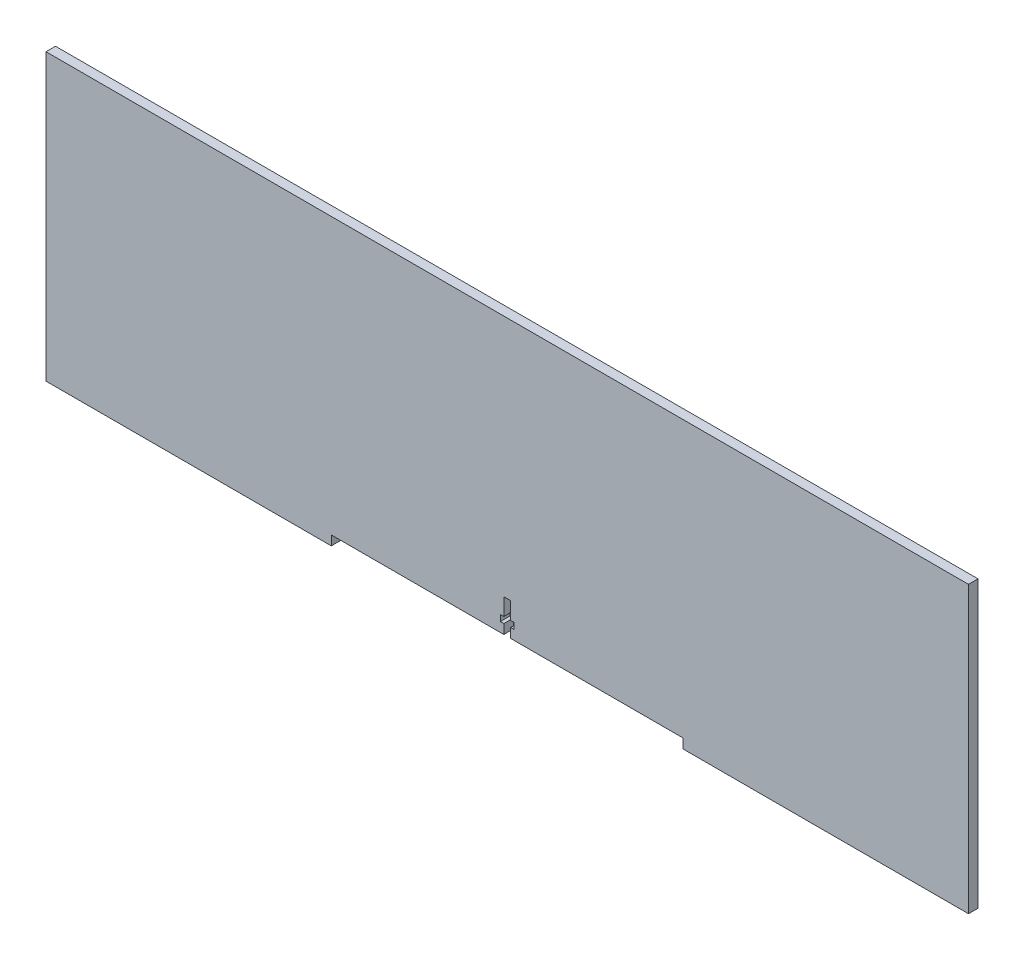
ISO-10303-21;
HEADER;
FILE_DESCRIPTION(('STEP AP214'),'2;1');
FILE_NAME('part.step','',(''),(''),'','','');
FILE_SCHEMA(('AUTOMOTIVE_DESIGN { 1 0 10303 214 1 1 1 1 }'));
ENDSEC;
DATA;
#1=APPLICATION_CONTEXT('core data for automotive mechanical design processes');
#2=APPLICATION_PROTOCOL_DEFINITION('international standard','automotive_design',2000,#1);
#3=PRODUCT_CONTEXT('',#1,'mechanical');
#4=PRODUCT('Part','Part','',(#3));
#5=PRODUCT_RELATED_PRODUCT_CATEGORY('part','',(#4));
#6=PRODUCT_DEFINITION_FORMATION('','',#4);
#7=PRODUCT_DEFINITION_CONTEXT('part definition',#1,'design');
#8=PRODUCT_DEFINITION('design','',#6,#7);
#9=PRODUCT_DEFINITION_SHAPE('','',#8);
#10=(LENGTH_UNIT() NAMED_UNIT(*) SI_UNIT(.MILLI.,.METRE.));
#11=(NAMED_UNIT(*) PLANE_ANGLE_UNIT() SI_UNIT($,.RADIAN.));
#12=(NAMED_UNIT(*) SI_UNIT($,.STERADIAN.) SOLID_ANGLE_UNIT());
#13=UNCERTAINTY_MEASURE_WITH_UNIT(LENGTH_MEASURE(1.E-05),#10,'distance_accuracy_value','');
#14=(GEOMETRIC_REPRESENTATION_CONTEXT(3) GLOBAL_UNCERTAINTY_ASSIGNED_CONTEXT((#13)) GLOBAL_UNIT_ASSIGNED_CONTEXT((#10,
#11,#12)) REPRESENTATION_CONTEXT('',''));
#15=CARTESIAN_POINT('',(0.,0.,0.));
#16=DIRECTION('',(0.,0.,1.));
#17=DIRECTION('',(1.,0.,0.));
#18=AXIS2_PLACEMENT_3D('',#15,#16,#17);
#19=CARTESIAN_POINT('',(0.,0.,5.));
#20=DIRECTION('',(0.,0.,1.));
#21=DIRECTION('',(1.,0.,0.));
#22=AXIS2_PLACEMENT_3D('',#19,#20,#21);
#23=PLANE('',#22);
#24=DIRECTION('',(1.,0.,0.));
#25=VECTOR('',#24,1.);
#26=CARTESIAN_POINT('',(0.,-5.,5.));
#27=LINE('',#26,#25);
#28=CARTESIAN_POINT('',(670.,-5.,5.));
#29=VERTEX_POINT('',#28);
#30=CARTESIAN_POINT('',(820.,-5.,5.));
#31=VERTEX_POINT('',#30);
#32=EDGE_CURVE('E182',#29,#31,#27,.T.);
#33=ORIENTED_EDGE('',*,*,#32,.T.);
#34=DIRECTION('',(0.,1.,0.));
#35=VECTOR('',#34,1.);
#36=CARTESIAN_POINT('',(820.,0.,5.));
#37=LINE('',#36,#35);
#38=CARTESIAN_POINT('',(820.,145.,5.));
#39=VERTEX_POINT('',#38);
#40=EDGE_CURVE('E170',#31,#39,#37,.T.);
#41=ORIENTED_EDGE('',*,*,#40,.T.);
#42=DIRECTION('',(1.,0.,0.));
#43=VECTOR('',#42,1.);
#44=CARTESIAN_POINT('',(0.,145.,5.));
#45=LINE('',#44,#43);
#46=CARTESIAN_POINT('',(335.,145.,5.));
#47=VERTEX_POINT('',#46);
#48=EDGE_CURVE('E180',#47,#39,#45,.T.);
#49=ORIENTED_EDGE('',*,*,#48,.F.);
#50=DIRECTION('',(0.,-1.,0.));
#51=VECTOR('',#50,1.);
#52=CARTESIAN_POINT('',(335.,0.,5.));
#53=LINE('',#52,#51);
#54=CARTESIAN_POINT('',(335.,-5.,5.));
#55=VERTEX_POINT('',#54);
#56=EDGE_CURVE('E270',#47,#55,#53,.T.);
#57=ORIENTED_EDGE('',*,*,#56,.T.);
#58=DIRECTION('',(-1.,0.,0.));
#59=VECTOR('',#58,1.);
#60=CARTESIAN_POINT('',(0.,-5.,5.));
#61=LINE('',#60,#59);
#62=CARTESIAN_POINT('',(485.,-5.,5.));
#63=VERTEX_POINT('',#62);
#64=EDGE_CURVE('E187',#63,#55,#61,.T.);
#65=ORIENTED_EDGE('',*,*,#64,.F.);
#66=DIRECTION('',(0.,-1.,0.));
#67=VECTOR('',#66,1.);
#68=CARTESIAN_POINT('',(485.,0.,5.));
#69=LINE('',#68,#67);
#70=CARTESIAN_POINT('',(485.,0.,5.));
#71=VERTEX_POINT('',#70);
#72=EDGE_CURVE('E190',#71,#63,#69,.T.);
#73=ORIENTED_EDGE('',*,*,#72,.F.);
#74=DIRECTION('',(1.,0.,0.));
#75=VECTOR('',#74,1.);
#76=CARTESIAN_POINT('',(0.,0.,5.));
#77=LINE('',#76,#75);
#78=CARTESIAN_POINT('',(575.7,0.,5.));
#79=VERTEX_POINT('',#78);
#80=EDGE_CURVE('E199',#71,#79,#77,.T.);
#81=ORIENTED_EDGE('',*,*,#80,.T.);
#82=DIRECTION('',(0.,1.,0.));
#83=VECTOR('',#82,1.);
#84=CARTESIAN_POINT('',(575.7,0.,5.));
#85=LINE('',#84,#83);
#86=CARTESIAN_POINT('',(575.7,5.00000000000001,5.));
#87=VERTEX_POINT('',#86);
#88=EDGE_CURVE('E299',#79,#87,#85,.T.);
#89=ORIENTED_EDGE('',*,*,#88,.T.);
#90=DIRECTION('',(-1.,0.,0.));
#91=VECTOR('',#90,1.);
#92=CARTESIAN_POINT('',(575.7,5.00000000000001,5.));
#93=LINE('',#92,#91);
#94=CARTESIAN_POINT('',(573.9,5.00000000000001,5.));
#95=VERTEX_POINT('',#94);
#96=EDGE_CURVE('E302',#87,#95,#93,.T.);
#97=ORIENTED_EDGE('',*,*,#96,.T.);
#98=DIRECTION('',(0.,1.,0.));
#99=VECTOR('',#98,1.);
#100=CARTESIAN_POINT('',(573.9,5.00000000000001,5.));
#101=LINE('',#100,#99);
#102=CARTESIAN_POINT('',(573.9,8.20000000000001,5.));
#103=VERTEX_POINT('',#102);
#104=EDGE_CURVE('E305',#95,#103,#101,.T.);
#105=ORIENTED_EDGE('',*,*,#104,.T.);
#106=DIRECTION('',(1.,0.,0.));
#107=VECTOR('',#106,1.);
#108=CARTESIAN_POINT('',(573.9,8.20000000000001,5.));
#109=LINE('',#108,#107);
#110=CARTESIAN_POINT('',(575.7,8.20000000000001,5.));
#111=VERTEX_POINT('',#110);
#112=EDGE_CURVE('E308',#103,#111,#109,.T.);
#113=ORIENTED_EDGE('',*,*,#112,.T.);
#114=DIRECTION('',(0.,1.,0.));
#115=VECTOR('',#114,1.);
#116=CARTESIAN_POINT('',(575.7,8.20000000000001,5.));
#117=LINE('',#116,#115);
#118=CARTESIAN_POINT('',(575.7,17.2,5.));
#119=VERTEX_POINT('',#118);
#120=EDGE_CURVE('E278',#111,#119,#117,.T.);
#121=ORIENTED_EDGE('',*,*,#120,.T.);
#122=DIRECTION('',(1.,0.,0.));
#123=VECTOR('',#122,1.);
#124=CARTESIAN_POINT('',(575.7,17.2,5.));
#125=LINE('',#124,#123);
#126=CARTESIAN_POINT('',(579.3,17.2,5.));
#127=VERTEX_POINT('',#126);
#128=EDGE_CURVE('E281',#119,#127,#125,.T.);
#129=ORIENTED_EDGE('',*,*,#128,.T.);
#130=DIRECTION('',(0.,1.,0.));
#131=VECTOR('',#130,1.);
#132=CARTESIAN_POINT('',(579.3,8.20000000000001,5.));
#133=LINE('',#132,#131);
#134=CARTESIAN_POINT('',(579.3,8.20000000000001,5.));
#135=VERTEX_POINT('',#134);
#136=EDGE_CURVE('E284',#135,#127,#133,.T.);
#137=ORIENTED_EDGE('',*,*,#136,.F.);
#138=DIRECTION('',(-1.,0.,0.));
#139=VECTOR('',#138,1.);
#140=CARTESIAN_POINT('',(581.1,8.20000000000001,5.));
#141=LINE('',#140,#139);
#142=CARTESIAN_POINT('',(581.1,8.20000000000001,5.));
#143=VERTEX_POINT('',#142);
#144=EDGE_CURVE('E287',#143,#135,#141,.T.);
#145=ORIENTED_EDGE('',*,*,#144,.F.);
#146=DIRECTION('',(0.,1.,0.));
#147=VECTOR('',#146,1.);
#148=CARTESIAN_POINT('',(581.1,5.00000000000001,5.));
#149=LINE('',#148,#147);
#150=CARTESIAN_POINT('',(581.1,5.00000000000001,5.));
#151=VERTEX_POINT('',#150);
#152=EDGE_CURVE('E290',#151,#143,#149,.T.);
#153=ORIENTED_EDGE('',*,*,#152,.F.);
#154=DIRECTION('',(1.,0.,0.));
#155=VECTOR('',#154,1.);
#156=CARTESIAN_POINT('',(579.3,5.00000000000001,5.));
#157=LINE('',#156,#155);
#158=CARTESIAN_POINT('',(579.3,5.00000000000001,5.));
#159=VERTEX_POINT('',#158);
#160=EDGE_CURVE('E293',#159,#151,#157,.T.);
#161=ORIENTED_EDGE('',*,*,#160,.F.);
#162=DIRECTION('',(0.,1.,0.));
#163=VECTOR('',#162,1.);
#164=CARTESIAN_POINT('',(579.3,0.,5.));
#165=LINE('',#164,#163);
#166=CARTESIAN_POINT('',(579.3,0.,5.));
#167=VERTEX_POINT('',#166);
#168=EDGE_CURVE('E296',#167,#159,#165,.T.);
#169=ORIENTED_EDGE('',*,*,#168,.F.);
#170=CARTESIAN_POINT('',(670.,0.,5.));
#171=VERTEX_POINT('',#170);
#172=EDGE_CURVE('E198',#167,#171,#77,.T.);
#173=ORIENTED_EDGE('',*,*,#172,.T.);
#174=DIRECTION('',(0.,-1.,0.));
#175=VECTOR('',#174,1.);
#176=CARTESIAN_POINT('',(670.,0.,5.));
#177=LINE('',#176,#175);
#178=EDGE_CURVE('E202',#171,#29,#177,.T.);
#179=ORIENTED_EDGE('',*,*,#178,.T.);
#180=EDGE_LOOP('',(#33,#41,#49,#57,#65,#73,#81,#89,#97,#105,#113,#121,#129,#137,#145,#153,#161,
#169,#173,#179));
#181=FACE_BOUND('',#180,.T.);
#182=ADVANCED_FACE('F35',(#181),#23,.T.);
#183=CARTESIAN_POINT('',(0.,0.,0.));
#184=DIRECTION('',(0.,0.,1.));
#185=DIRECTION('',(1.,0.,0.));
#186=AXIS2_PLACEMENT_3D('',#183,#184,#185);
#187=PLANE('',#186);
#188=DIRECTION('',(0.,1.,0.));
#189=VECTOR('',#188,1.);
#190=CARTESIAN_POINT('',(820.,0.,0.));
#191=LINE('',#190,#189);
#192=CARTESIAN_POINT('',(820.,-5.,0.));
#193=VERTEX_POINT('',#192);
#194=CARTESIAN_POINT('',(820.,145.,0.));
#195=VERTEX_POINT('',#194);
#196=EDGE_CURVE('E50',#193,#195,#191,.T.);
#197=ORIENTED_EDGE('',*,*,#196,.F.);
#198=DIRECTION('',(1.,0.,0.));
#199=VECTOR('',#198,1.);
#200=CARTESIAN_POINT('',(0.,-5.,0.));
#201=LINE('',#200,#199);
#202=CARTESIAN_POINT('',(670.,-5.,0.));
#203=VERTEX_POINT('',#202);
#204=EDGE_CURVE('E205',#203,#193,#201,.T.);
#205=ORIENTED_EDGE('',*,*,#204,.F.);
#206=DIRECTION('',(0.,-1.,0.));
#207=VECTOR('',#206,1.);
#208=CARTESIAN_POINT('',(670.,0.,0.));
#209=LINE('',#208,#207);
#210=CARTESIAN_POINT('',(670.,0.,0.));
#211=VERTEX_POINT('',#210);
#212=EDGE_CURVE('E192',#211,#203,#209,.T.);
#213=ORIENTED_EDGE('',*,*,#212,.F.);
#214=DIRECTION('',(1.,0.,0.));
#215=VECTOR('',#214,1.);
#216=CARTESIAN_POINT('',(0.,0.,0.));
#217=LINE('',#216,#215);
#218=CARTESIAN_POINT('',(579.3,0.,0.));
#219=VERTEX_POINT('',#218);
#220=EDGE_CURVE('E217',#219,#211,#217,.T.);
#221=ORIENTED_EDGE('',*,*,#220,.F.);
#222=DIRECTION('',(0.,1.,0.));
#223=VECTOR('',#222,1.);
#224=CARTESIAN_POINT('',(579.3,0.,0.));
#225=LINE('',#224,#223);
#226=CARTESIAN_POINT('',(579.3,5.00000000000001,0.));
#227=VERTEX_POINT('',#226);
#228=EDGE_CURVE('E209',#219,#227,#225,.T.);
#229=ORIENTED_EDGE('',*,*,#228,.T.);
#230=DIRECTION('',(1.,0.,0.));
#231=VECTOR('',#230,1.);
#232=CARTESIAN_POINT('',(0.,4.99999999999973,0.));
#233=LINE('',#232,#231);
#234=CARTESIAN_POINT('',(581.1,5.00000000000001,0.));
#235=VERTEX_POINT('',#234);
#236=EDGE_CURVE('E255',#227,#235,#233,.T.);
#237=ORIENTED_EDGE('',*,*,#236,.T.);
#238=DIRECTION('',(0.,1.,0.));
#239=VECTOR('',#238,1.);
#240=CARTESIAN_POINT('',(581.1,0.,0.));
#241=LINE('',#240,#239);
#242=CARTESIAN_POINT('',(581.1,8.20000000000001,0.));
#243=VERTEX_POINT('',#242);
#244=EDGE_CURVE('E252',#235,#243,#241,.T.);
#245=ORIENTED_EDGE('',*,*,#244,.T.);
#246=DIRECTION('',(-1.,0.,0.));
#247=VECTOR('',#246,1.);
#248=CARTESIAN_POINT('',(0.,8.20000000000001,0.));
#249=LINE('',#248,#247);
#250=CARTESIAN_POINT('',(579.3,8.20000000000001,0.));
#251=VERTEX_POINT('',#250);
#252=EDGE_CURVE('E249',#243,#251,#249,.T.);
#253=ORIENTED_EDGE('',*,*,#252,.T.);
#254=DIRECTION('',(0.,1.,0.));
#255=VECTOR('',#254,1.);
#256=CARTESIAN_POINT('',(579.3,0.,0.));
#257=LINE('',#256,#255);
#258=CARTESIAN_POINT('',(579.3,17.2,0.));
#259=VERTEX_POINT('',#258);
#260=EDGE_CURVE('E246',#251,#259,#257,.T.);
#261=ORIENTED_EDGE('',*,*,#260,.T.);
#262=DIRECTION('',(1.,0.,0.));
#263=VECTOR('',#262,1.);
#264=CARTESIAN_POINT('',(0.,17.2,0.));
#265=LINE('',#264,#263);
#266=CARTESIAN_POINT('',(575.7,17.2,0.));
#267=VERTEX_POINT('',#266);
#268=EDGE_CURVE('E244',#267,#259,#265,.T.);
#269=ORIENTED_EDGE('',*,*,#268,.F.);
#270=DIRECTION('',(0.,1.,0.));
#271=VECTOR('',#270,1.);
#272=CARTESIAN_POINT('',(575.7,0.,0.));
#273=LINE('',#272,#271);
#274=CARTESIAN_POINT('',(575.7,8.20000000000001,0.));
#275=VERTEX_POINT('',#274);
#276=EDGE_CURVE('E242',#275,#267,#273,.T.);
#277=ORIENTED_EDGE('',*,*,#276,.F.);
#278=DIRECTION('',(1.,0.,0.));
#279=VECTOR('',#278,1.);
#280=CARTESIAN_POINT('',(0.,8.20000000000001,0.));
#281=LINE('',#280,#279);
#282=CARTESIAN_POINT('',(573.9,8.20000000000001,0.));
#283=VERTEX_POINT('',#282);
#284=EDGE_CURVE('E236',#283,#275,#281,.T.);
#285=ORIENTED_EDGE('',*,*,#284,.F.);
#286=DIRECTION('',(0.,1.,0.));
#287=VECTOR('',#286,1.);
#288=CARTESIAN_POINT('',(573.9,0.,0.));
#289=LINE('',#288,#287);
#290=CARTESIAN_POINT('',(573.9,5.00000000000001,0.));
#291=VERTEX_POINT('',#290);
#292=EDGE_CURVE('E238',#291,#283,#289,.T.);
#293=ORIENTED_EDGE('',*,*,#292,.F.);
#294=DIRECTION('',(-1.,0.,0.));
#295=VECTOR('',#294,1.);
#296=CARTESIAN_POINT('',(0.,5.00000000000028,0.));
#297=LINE('',#296,#295);
#298=CARTESIAN_POINT('',(575.7,5.00000000000001,0.));
#299=VERTEX_POINT('',#298);
#300=EDGE_CURVE('E240',#299,#291,#297,.T.);
#301=ORIENTED_EDGE('',*,*,#300,.F.);
#302=DIRECTION('',(0.,1.,0.));
#303=VECTOR('',#302,1.);
#304=CARTESIAN_POINT('',(575.7,0.,0.));
#305=LINE('',#304,#303);
#306=CARTESIAN_POINT('',(575.7,0.,0.));
#307=VERTEX_POINT('',#306);
#308=EDGE_CURVE('E331',#307,#299,#305,.T.);
#309=ORIENTED_EDGE('',*,*,#308,.F.);
#310=CARTESIAN_POINT('',(485.,0.,0.));
#311=VERTEX_POINT('',#310);
#312=EDGE_CURVE('E218',#311,#307,#217,.T.);
#313=ORIENTED_EDGE('',*,*,#312,.F.);
#314=DIRECTION('',(0.,-1.,0.));
#315=VECTOR('',#314,1.);
#316=CARTESIAN_POINT('',(485.,0.,0.));
#317=LINE('',#316,#315);
#318=CARTESIAN_POINT('',(485.,-5.,0.));
#319=VERTEX_POINT('',#318);
#320=EDGE_CURVE('E214',#311,#319,#317,.T.);
#321=ORIENTED_EDGE('',*,*,#320,.T.);
#322=DIRECTION('',(-1.,0.,0.));
#323=VECTOR('',#322,1.);
#324=CARTESIAN_POINT('',(0.,-5.,0.));
#325=LINE('',#324,#323);
#326=CARTESIAN_POINT('',(335.,-5.,0.));
#327=VERTEX_POINT('',#326);
#328=EDGE_CURVE('E211',#319,#327,#325,.T.);
#329=ORIENTED_EDGE('',*,*,#328,.T.);
#330=DIRECTION('',(0.,-1.,0.));
#331=VECTOR('',#330,1.);
#332=CARTESIAN_POINT('',(335.,0.,0.));
#333=LINE('',#332,#331);
#334=CARTESIAN_POINT('',(335.,145.,0.));
#335=VERTEX_POINT('',#334);
#336=EDGE_CURVE('E57',#335,#327,#333,.T.);
#337=ORIENTED_EDGE('',*,*,#336,.F.);
#338=DIRECTION('',(1.,0.,0.));
#339=VECTOR('',#338,1.);
#340=CARTESIAN_POINT('',(0.,145.,0.));
#341=LINE('',#340,#339);
#342=EDGE_CURVE('E208',#335,#195,#341,.T.);
#343=ORIENTED_EDGE('',*,*,#342,.T.);
#344=EDGE_LOOP('',(#197,#205,#213,#221,#229,#237,#245,#253,#261,#269,#277,#285,#293,#301,#309,
#313,#321,#329,#337,#343));
#345=FACE_BOUND('',#344,.T.);
#346=ADVANCED_FACE('F262',(#345),#187,.F.);
#347=CARTESIAN_POINT('',(0.,-5.,5.));
#348=DIRECTION('',(0.,1.,0.));
#349=DIRECTION('',(0.,0.,1.));
#350=AXIS2_PLACEMENT_3D('',#347,#348,#349);
#351=PLANE('',#350);
#352=DIRECTION('',(0.,0.,-1.));
#353=VECTOR('',#352,1.);
#354=CARTESIAN_POINT('',(820.,-5.,5.));
#355=LINE('',#354,#353);
#356=EDGE_CURVE('E275',#31,#193,#355,.T.);
#357=ORIENTED_EDGE('',*,*,#356,.F.);
#358=ORIENTED_EDGE('',*,*,#32,.F.);
#359=DIRECTION('',(0.,0.,-1.));
#360=VECTOR('',#359,1.);
#361=CARTESIAN_POINT('',(670.,-5.,5.));
#362=LINE('',#361,#360);
#363=EDGE_CURVE('E204',#29,#203,#362,.T.);
#364=ORIENTED_EDGE('',*,*,#363,.T.);
#365=ORIENTED_EDGE('',*,*,#204,.T.);
#366=EDGE_LOOP('',(#357,#358,#364,#365));
#367=FACE_BOUND('',#366,.T.);
#368=ADVANCED_FACE('F37',(#367),#351,.F.);
#369=CARTESIAN_POINT('',(0.,145.,5.));
#370=DIRECTION('',(0.,1.,0.));
#371=DIRECTION('',(0.,0.,1.));
#372=AXIS2_PLACEMENT_3D('',#369,#370,#371);
#373=PLANE('',#372);
#374=ORIENTED_EDGE('',*,*,#48,.T.);
#375=DIRECTION('',(0.,0.,-1.));
#376=VECTOR('',#375,1.);
#377=CARTESIAN_POINT('',(820.,145.,5.));
#378=LINE('',#377,#376);
#379=EDGE_CURVE('E11',#39,#195,#378,.T.);
#380=ORIENTED_EDGE('',*,*,#379,.T.);
#381=ORIENTED_EDGE('',*,*,#342,.F.);
#382=DIRECTION('',(0.,0.,1.));
#383=VECTOR('',#382,1.);
#384=CARTESIAN_POINT('',(335.,145.,-5.));
#385=LINE('',#384,#383);
#386=EDGE_CURVE('E183',#335,#47,#385,.T.);
#387=ORIENTED_EDGE('',*,*,#386,.T.);
#388=EDGE_LOOP('',(#374,#380,#381,#387));
#389=FACE_BOUND('',#388,.T.);
#390=ADVANCED_FACE('F186',(#389),#373,.T.);
#391=CARTESIAN_POINT('',(0.,-5.,5.));
#392=DIRECTION('',(0.,-1.,0.));
#393=DIRECTION('',(0.,0.,-1.));
#394=AXIS2_PLACEMENT_3D('',#391,#392,#393);
#395=PLANE('',#394);
#396=ORIENTED_EDGE('',*,*,#64,.T.);
#397=DIRECTION('',(0.,0.,-1.));
#398=VECTOR('',#397,1.);
#399=CARTESIAN_POINT('',(335.,-5.,5.));
#400=LINE('',#399,#398);
#401=EDGE_CURVE('E43',#55,#327,#400,.T.);
#402=ORIENTED_EDGE('',*,*,#401,.T.);
#403=ORIENTED_EDGE('',*,*,#328,.F.);
#404=DIRECTION('',(0.,0.,-1.));
#405=VECTOR('',#404,1.);
#406=CARTESIAN_POINT('',(485.,-5.,5.));
#407=LINE('',#406,#405);
#408=EDGE_CURVE('E229',#63,#319,#407,.T.);
#409=ORIENTED_EDGE('',*,*,#408,.F.);
#410=EDGE_LOOP('',(#396,#402,#403,#409));
#411=FACE_BOUND('',#410,.T.);
#412=ADVANCED_FACE('F259',(#411),#395,.T.);
#413=CARTESIAN_POINT('',(0.,0.,5.));
#414=DIRECTION('',(0.,1.,0.));
#415=DIRECTION('',(0.,0.,1.));
#416=AXIS2_PLACEMENT_3D('',#413,#414,#415);
#417=PLANE('',#416);
#418=DIRECTION('',(0.,0.,-1.));
#419=VECTOR('',#418,1.);
#420=CARTESIAN_POINT('',(575.7,0.,5.));
#421=LINE('',#420,#419);
#422=EDGE_CURVE('E231',#79,#307,#421,.T.);
#423=ORIENTED_EDGE('',*,*,#422,.F.);
#424=ORIENTED_EDGE('',*,*,#80,.F.);
#425=DIRECTION('',(0.,0.,-1.));
#426=VECTOR('',#425,1.);
#427=CARTESIAN_POINT('',(485.,0.,5.));
#428=LINE('',#427,#426);
#429=EDGE_CURVE('E227',#71,#311,#428,.T.);
#430=ORIENTED_EDGE('',*,*,#429,.T.);
#431=ORIENTED_EDGE('',*,*,#312,.T.);
#432=EDGE_LOOP('',(#423,#424,#430,#431));
#433=FACE_BOUND('',#432,.T.);
#434=ADVANCED_FACE('F390',(#433),#417,.F.);
#435=CARTESIAN_POINT('',(485.,0.,5.));
#436=DIRECTION('',(1.,0.,0.));
#437=DIRECTION('',(0.,0.,-1.));
#438=AXIS2_PLACEMENT_3D('',#435,#436,#437);
#439=PLANE('',#438);
#440=ORIENTED_EDGE('',*,*,#320,.F.);
#441=ORIENTED_EDGE('',*,*,#429,.F.);
#442=ORIENTED_EDGE('',*,*,#72,.T.);
#443=ORIENTED_EDGE('',*,*,#408,.T.);
#444=EDGE_LOOP('',(#440,#441,#442,#443));
#445=FACE_BOUND('',#444,.T.);
#446=ADVANCED_FACE('F267',(#445),#439,.T.);
#447=ORIENTED_EDGE('',*,*,#172,.F.);
#448=DIRECTION('',(0.,0.,-1.));
#449=VECTOR('',#448,1.);
#450=CARTESIAN_POINT('',(579.3,0.,5.));
#451=LINE('',#450,#449);
#452=EDGE_CURVE('E233',#167,#219,#451,.T.);
#453=ORIENTED_EDGE('',*,*,#452,.T.);
#454=ORIENTED_EDGE('',*,*,#220,.T.);
#455=DIRECTION('',(0.,0.,-1.));
#456=VECTOR('',#455,1.);
#457=CARTESIAN_POINT('',(670.,0.,5.));
#458=LINE('',#457,#456);
#459=EDGE_CURVE('E224',#171,#211,#458,.T.);
#460=ORIENTED_EDGE('',*,*,#459,.F.);
#461=EDGE_LOOP('',(#447,#453,#454,#460));
#462=FACE_BOUND('',#461,.T.);
#463=ADVANCED_FACE('F341',(#462),#417,.F.);
#464=CARTESIAN_POINT('',(670.,0.,5.));
#465=DIRECTION('',(1.,0.,0.));
#466=DIRECTION('',(0.,0.,-1.));
#467=AXIS2_PLACEMENT_3D('',#464,#465,#466);
#468=PLANE('',#467);
#469=ORIENTED_EDGE('',*,*,#212,.T.);
#470=ORIENTED_EDGE('',*,*,#363,.F.);
#471=ORIENTED_EDGE('',*,*,#178,.F.);
#472=ORIENTED_EDGE('',*,*,#459,.T.);
#473=EDGE_LOOP('',(#469,#470,#471,#472));
#474=FACE_BOUND('',#473,.T.);
#475=ADVANCED_FACE('F401',(#474),#468,.F.);
#476=CARTESIAN_POINT('',(575.7,8.20000000000001,-5.));
#477=DIRECTION('',(1.,0.,0.));
#478=DIRECTION('',(0.,0.,-1.));
#479=AXIS2_PLACEMENT_3D('',#476,#477,#478);
#480=PLANE('',#479);
#481=ORIENTED_EDGE('',*,*,#276,.T.);
#482=DIRECTION('',(0.,0.,1.));
#483=VECTOR('',#482,1.);
#484=CARTESIAN_POINT('',(575.7,17.2,-5.));
#485=LINE('',#484,#483);
#486=EDGE_CURVE('E329',#267,#119,#485,.T.);
#487=ORIENTED_EDGE('',*,*,#486,.T.);
#488=ORIENTED_EDGE('',*,*,#120,.F.);
#489=DIRECTION('',(0.,0.,1.));
#490=VECTOR('',#489,1.);
#491=CARTESIAN_POINT('',(575.7,8.20000000000001,-5.));
#492=LINE('',#491,#490);
#493=EDGE_CURVE('E311',#275,#111,#492,.T.);
#494=ORIENTED_EDGE('',*,*,#493,.F.);
#495=EDGE_LOOP('',(#481,#487,#488,#494));
#496=FACE_BOUND('',#495,.T.);
#497=ADVANCED_FACE('F371',(#496),#480,.T.);
#498=CARTESIAN_POINT('',(575.7,17.2,-5.));
#499=DIRECTION('',(0.,-1.,0.));
#500=DIRECTION('',(0.,0.,-1.));
#501=AXIS2_PLACEMENT_3D('',#498,#499,#500);
#502=PLANE('',#501);
#503=ORIENTED_EDGE('',*,*,#268,.T.);
#504=DIRECTION('',(0.,0.,1.));
#505=VECTOR('',#504,1.);
#506=CARTESIAN_POINT('',(579.3,17.2,-5.));
#507=LINE('',#506,#505);
#508=EDGE_CURVE('E327',#259,#127,#507,.T.);
#509=ORIENTED_EDGE('',*,*,#508,.T.);
#510=ORIENTED_EDGE('',*,*,#128,.F.);
#511=ORIENTED_EDGE('',*,*,#486,.F.);
#512=EDGE_LOOP('',(#503,#509,#510,#511));
#513=FACE_BOUND('',#512,.T.);
#514=ADVANCED_FACE('F364',(#513),#502,.T.);
#515=CARTESIAN_POINT('',(579.3,8.20000000000001,-5.));
#516=DIRECTION('',(1.,0.,0.));
#517=DIRECTION('',(0.,0.,-1.));
#518=AXIS2_PLACEMENT_3D('',#515,#516,#517);
#519=PLANE('',#518);
#520=DIRECTION('',(0.,0.,1.));
#521=VECTOR('',#520,1.);
#522=CARTESIAN_POINT('',(579.3,8.20000000000001,-5.));
#523=LINE('',#522,#521);
#524=EDGE_CURVE('E325',#251,#135,#523,.T.);
#525=ORIENTED_EDGE('',*,*,#524,.T.);
#526=ORIENTED_EDGE('',*,*,#136,.T.);
#527=ORIENTED_EDGE('',*,*,#508,.F.);
#528=ORIENTED_EDGE('',*,*,#260,.F.);
#529=EDGE_LOOP('',(#525,#526,#527,#528));
#530=FACE_BOUND('',#529,.T.);
#531=ADVANCED_FACE('F360',(#530),#519,.F.);
#532=CARTESIAN_POINT('',(581.1,8.20000000000001,-5.));
#533=DIRECTION('',(0.,1.,0.));
#534=DIRECTION('',(0.,0.,1.));
#535=AXIS2_PLACEMENT_3D('',#532,#533,#534);
#536=PLANE('',#535);
#537=DIRECTION('',(0.,0.,1.));
#538=VECTOR('',#537,1.);
#539=CARTESIAN_POINT('',(581.1,8.20000000000001,-5.));
#540=LINE('',#539,#538);
#541=EDGE_CURVE('E323',#243,#143,#540,.T.);
#542=ORIENTED_EDGE('',*,*,#541,.T.);
#543=ORIENTED_EDGE('',*,*,#144,.T.);
#544=ORIENTED_EDGE('',*,*,#524,.F.);
#545=ORIENTED_EDGE('',*,*,#252,.F.);
#546=EDGE_LOOP('',(#542,#543,#544,#545));
#547=FACE_BOUND('',#546,.T.);
#548=ADVANCED_FACE('F357',(#547),#536,.F.);
#549=CARTESIAN_POINT('',(581.1,5.00000000000001,-5.));
#550=DIRECTION('',(1.,0.,0.));
#551=DIRECTION('',(0.,0.,-1.));
#552=AXIS2_PLACEMENT_3D('',#549,#550,#551);
#553=PLANE('',#552);
#554=DIRECTION('',(0.,0.,1.));
#555=VECTOR('',#554,1.);
#556=CARTESIAN_POINT('',(581.1,5.00000000000001,-5.));
#557=LINE('',#556,#555);
#558=EDGE_CURVE('E321',#235,#151,#557,.T.);
#559=ORIENTED_EDGE('',*,*,#558,.T.);
#560=ORIENTED_EDGE('',*,*,#152,.T.);
#561=ORIENTED_EDGE('',*,*,#541,.F.);
#562=ORIENTED_EDGE('',*,*,#244,.F.);
#563=EDGE_LOOP('',(#559,#560,#561,#562));
#564=FACE_BOUND('',#563,.T.);
#565=ADVANCED_FACE('F352',(#564),#553,.F.);
#566=CARTESIAN_POINT('',(579.3,5.00000000000001,-5.));
#567=DIRECTION('',(0.,-1.,0.));
#568=DIRECTION('',(1.,0.,0.));
#569=AXIS2_PLACEMENT_3D('',#566,#567,#568);
#570=PLANE('',#569);
#571=DIRECTION('',(0.,0.,1.));
#572=VECTOR('',#571,1.);
#573=CARTESIAN_POINT('',(579.3,5.00000000000001,-5.));
#574=LINE('',#573,#572);
#575=EDGE_CURVE('E319',#227,#159,#574,.T.);
#576=ORIENTED_EDGE('',*,*,#575,.T.);
#577=ORIENTED_EDGE('',*,*,#160,.T.);
#578=ORIENTED_EDGE('',*,*,#558,.F.);
#579=ORIENTED_EDGE('',*,*,#236,.F.);
#580=EDGE_LOOP('',(#576,#577,#578,#579));
#581=FACE_BOUND('',#580,.T.);
#582=ADVANCED_FACE('F350',(#581),#570,.F.);
#583=CARTESIAN_POINT('',(575.7,5.00000000000001,-5.));
#584=DIRECTION('',(0.,1.,0.));
#585=DIRECTION('',(-1.,0.,0.));
#586=AXIS2_PLACEMENT_3D('',#583,#584,#585);
#587=PLANE('',#586);
#588=ORIENTED_EDGE('',*,*,#300,.T.);
#589=DIRECTION('',(0.,0.,1.));
#590=VECTOR('',#589,1.);
#591=CARTESIAN_POINT('',(573.9,5.00000000000001,-5.));
#592=LINE('',#591,#590);
#593=EDGE_CURVE('E315',#291,#95,#592,.T.);
#594=ORIENTED_EDGE('',*,*,#593,.T.);
#595=ORIENTED_EDGE('',*,*,#96,.F.);
#596=DIRECTION('',(0.,0.,1.));
#597=VECTOR('',#596,1.);
#598=CARTESIAN_POINT('',(575.7,5.00000000000001,-5.));
#599=LINE('',#598,#597);
#600=EDGE_CURVE('E317',#299,#87,#599,.T.);
#601=ORIENTED_EDGE('',*,*,#600,.F.);
#602=EDGE_LOOP('',(#588,#594,#595,#601));
#603=FACE_BOUND('',#602,.T.);
#604=ADVANCED_FACE('F384',(#603),#587,.T.);
#605=CARTESIAN_POINT('',(573.9,5.00000000000001,-5.));
#606=DIRECTION('',(1.,0.,0.));
#607=DIRECTION('',(0.,0.,-1.));
#608=AXIS2_PLACEMENT_3D('',#605,#606,#607);
#609=PLANE('',#608);
#610=ORIENTED_EDGE('',*,*,#292,.T.);
#611=DIRECTION('',(0.,0.,1.));
#612=VECTOR('',#611,1.);
#613=CARTESIAN_POINT('',(573.9,8.20000000000001,-5.));
#614=LINE('',#613,#612);
#615=EDGE_CURVE('E313',#283,#103,#614,.T.);
#616=ORIENTED_EDGE('',*,*,#615,.T.);
#617=ORIENTED_EDGE('',*,*,#104,.F.);
#618=ORIENTED_EDGE('',*,*,#593,.F.);
#619=EDGE_LOOP('',(#610,#616,#617,#618));
#620=FACE_BOUND('',#619,.T.);
#621=ADVANCED_FACE('F379',(#620),#609,.T.);
#622=CARTESIAN_POINT('',(573.9,8.20000000000001,-5.));
#623=DIRECTION('',(0.,-1.,0.));
#624=DIRECTION('',(0.,0.,-1.));
#625=AXIS2_PLACEMENT_3D('',#622,#623,#624);
#626=PLANE('',#625);
#627=ORIENTED_EDGE('',*,*,#284,.T.);
#628=ORIENTED_EDGE('',*,*,#493,.T.);
#629=ORIENTED_EDGE('',*,*,#112,.F.);
#630=ORIENTED_EDGE('',*,*,#615,.F.);
#631=EDGE_LOOP('',(#627,#628,#629,#630));
#632=FACE_BOUND('',#631,.T.);
#633=ADVANCED_FACE('F375',(#632),#626,.T.);
#634=CARTESIAN_POINT('',(579.3,0.,-5.));
#635=DIRECTION('',(1.,0.,0.));
#636=DIRECTION('',(0.,0.,-1.));
#637=AXIS2_PLACEMENT_3D('',#634,#635,#636);
#638=PLANE('',#637);
#639=ORIENTED_EDGE('',*,*,#452,.F.);
#640=ORIENTED_EDGE('',*,*,#168,.T.);
#641=ORIENTED_EDGE('',*,*,#575,.F.);
#642=ORIENTED_EDGE('',*,*,#228,.F.);
#643=EDGE_LOOP('',(#639,#640,#641,#642));
#644=FACE_BOUND('',#643,.T.);
#645=ADVANCED_FACE('F337',(#644),#638,.F.);
#646=CARTESIAN_POINT('',(575.7,0.,-5.));
#647=DIRECTION('',(1.,0.,0.));
#648=DIRECTION('',(0.,0.,-1.));
#649=AXIS2_PLACEMENT_3D('',#646,#647,#648);
#650=PLANE('',#649);
#651=ORIENTED_EDGE('',*,*,#308,.T.);
#652=ORIENTED_EDGE('',*,*,#600,.T.);
#653=ORIENTED_EDGE('',*,*,#88,.F.);
#654=ORIENTED_EDGE('',*,*,#422,.T.);
#655=EDGE_LOOP('',(#651,#652,#653,#654));
#656=FACE_BOUND('',#655,.T.);
#657=ADVANCED_FACE('F387',(#656),#650,.T.);
#658=CARTESIAN_POINT('',(335.,0.,-5.));
#659=DIRECTION('',(-1.,0.,0.));
#660=DIRECTION('',(0.,0.,1.));
#661=AXIS2_PLACEMENT_3D('',#658,#659,#660);
#662=PLANE('',#661);
#663=ORIENTED_EDGE('',*,*,#336,.T.);
#664=ORIENTED_EDGE('',*,*,#401,.F.);
#665=ORIENTED_EDGE('',*,*,#56,.F.);
#666=ORIENTED_EDGE('',*,*,#386,.F.);
#667=EDGE_LOOP('',(#663,#664,#665,#666));
#668=FACE_BOUND('',#667,.T.);
#669=ADVANCED_FACE('F434',(#668),#662,.T.);
#670=CARTESIAN_POINT('',(820.,0.,-5.));
#671=DIRECTION('',(1.,0.,0.));
#672=DIRECTION('',(0.,0.,-1.));
#673=AXIS2_PLACEMENT_3D('',#670,#671,#672);
#674=PLANE('',#673);
#675=ORIENTED_EDGE('',*,*,#196,.T.);
#676=ORIENTED_EDGE('',*,*,#379,.F.);
#677=ORIENTED_EDGE('',*,*,#40,.F.);
#678=ORIENTED_EDGE('',*,*,#356,.T.);
#679=EDGE_LOOP('',(#675,#676,#677,#678));
#680=FACE_BOUND('',#679,.T.);
#681=ADVANCED_FACE('F169',(#680),#674,.T.);
#682=CLOSED_SHELL('',(#182,#346,#368,#390,#412,#434,#446,#463,#475,#497,#514,#531,#548,#565,
#582,#604,#621,#633,#645,#657,#669,#681));
#683=MANIFOLD_SOLID_BREP('B2',#682);
#684=ADVANCED_BREP_SHAPE_REPRESENTATION('',(#18,#683),#14);
#685=SHAPE_DEFINITION_REPRESENTATION(#9,#684);
ENDSEC;
END-ISO-10303-21;
